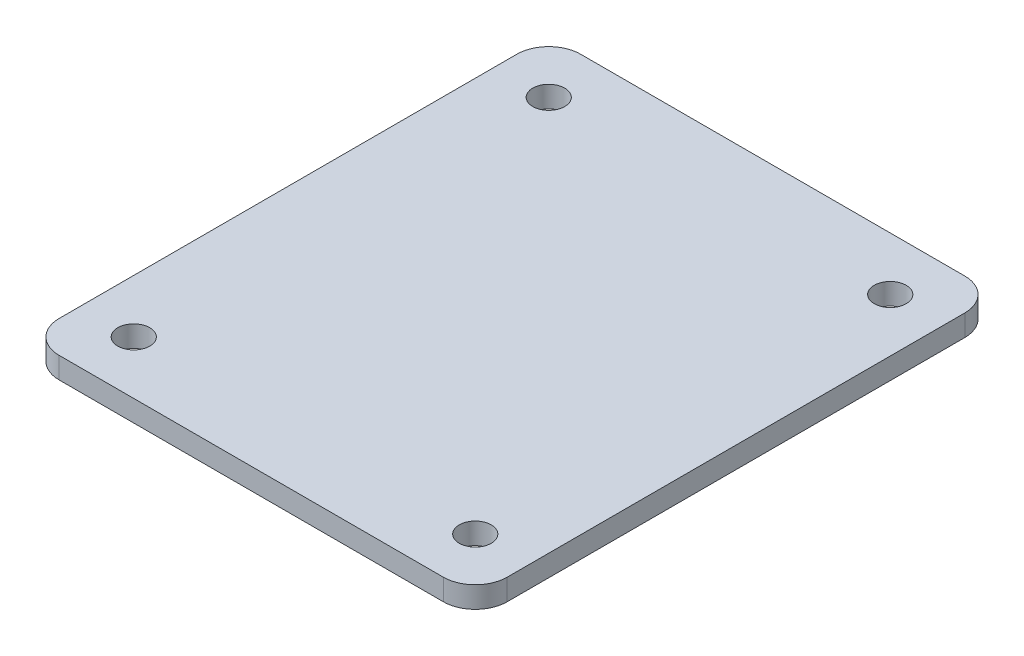
ISO-10303-21;
HEADER;
FILE_DESCRIPTION(('STEP AP214'),'2;1');
FILE_NAME('part.step','',(''),(''),'','','');
FILE_SCHEMA(('AUTOMOTIVE_DESIGN { 1 0 10303 214 1 1 1 1 }'));
ENDSEC;
DATA;
#1=APPLICATION_CONTEXT('core data for automotive mechanical design processes');
#2=APPLICATION_PROTOCOL_DEFINITION('international standard','automotive_design',2000,#1);
#3=PRODUCT_CONTEXT('',#1,'mechanical');
#4=PRODUCT('Part','Part','',(#3));
#5=PRODUCT_RELATED_PRODUCT_CATEGORY('part','',(#4));
#6=PRODUCT_DEFINITION_FORMATION('','',#4);
#7=PRODUCT_DEFINITION_CONTEXT('part definition',#1,'design');
#8=PRODUCT_DEFINITION('design','',#6,#7);
#9=PRODUCT_DEFINITION_SHAPE('','',#8);
#10=(LENGTH_UNIT() NAMED_UNIT(*) SI_UNIT(.MILLI.,.METRE.));
#11=(NAMED_UNIT(*) PLANE_ANGLE_UNIT() SI_UNIT($,.RADIAN.));
#12=(NAMED_UNIT(*) SI_UNIT($,.STERADIAN.) SOLID_ANGLE_UNIT());
#13=UNCERTAINTY_MEASURE_WITH_UNIT(LENGTH_MEASURE(1.E-05),#10,'distance_accuracy_value','');
#14=(GEOMETRIC_REPRESENTATION_CONTEXT(3) GLOBAL_UNCERTAINTY_ASSIGNED_CONTEXT((#13)) GLOBAL_UNIT_ASSIGNED_CONTEXT((#10,
#11,#12)) REPRESENTATION_CONTEXT('',''));
#15=CARTESIAN_POINT('',(0.,0.,0.));
#16=DIRECTION('',(0.,0.,1.));
#17=DIRECTION('',(1.,0.,0.));
#18=AXIS2_PLACEMENT_3D('',#15,#16,#17);
#19=CARTESIAN_POINT('',(21.0193971695219,2.,24.4666027061899));
#20=DIRECTION('',(-1.,0.,0.));
#21=DIRECTION('',(0.,0.,1.));
#22=AXIS2_PLACEMENT_3D('',#19,#20,#21);
#23=PLANE('',#22);
#24=DIRECTION('',(0.,0.,-1.));
#25=VECTOR('',#24,1.);
#26=CARTESIAN_POINT('',(21.0193971695219,0.,24.4666027061899));
#27=LINE('',#26,#25);
#28=CARTESIAN_POINT('',(21.0193971695219,0.,21.4666027061899));
#29=VERTEX_POINT('',#28);
#30=CARTESIAN_POINT('',(21.0193971695219,0.,-21.4666027061899));
#31=VERTEX_POINT('',#30);
#32=EDGE_CURVE('E132',#29,#31,#27,.T.);
#33=ORIENTED_EDGE('',*,*,#32,.T.);
#34=DIRECTION('',(0.,-1.,0.));
#35=VECTOR('',#34,1.);
#36=CARTESIAN_POINT('',(21.0193971695219,2.,-21.4666027061899));
#37=LINE('',#36,#35);
#38=CARTESIAN_POINT('',(21.0193971695219,2.,-21.4666027061899));
#39=VERTEX_POINT('',#38);
#40=EDGE_CURVE('E155',#31,#39,#37,.F.);
#41=ORIENTED_EDGE('',*,*,#40,.T.);
#42=DIRECTION('',(0.,0.,-1.));
#43=VECTOR('',#42,1.);
#44=CARTESIAN_POINT('',(21.0193971695219,2.,24.4666027061899));
#45=LINE('',#44,#43);
#46=CARTESIAN_POINT('',(21.0193971695219,2.,21.4666027061899));
#47=VERTEX_POINT('',#46);
#48=EDGE_CURVE('E130',#47,#39,#45,.T.);
#49=ORIENTED_EDGE('',*,*,#48,.F.);
#50=DIRECTION('',(0.,-1.,0.));
#51=VECTOR('',#50,1.);
#52=CARTESIAN_POINT('',(21.0193971695219,2.,21.4666027061899));
#53=LINE('',#52,#51);
#54=EDGE_CURVE('E152',#47,#29,#53,.T.);
#55=ORIENTED_EDGE('',*,*,#54,.T.);
#56=EDGE_LOOP('',(#33,#41,#49,#55));
#57=FACE_BOUND('',#56,.T.);
#58=ADVANCED_FACE('F37',(#57),#23,.F.);
#59=CARTESIAN_POINT('',(-21.0193971695219,2.,-24.4666027061899));
#60=DIRECTION('',(0.,0.,1.));
#61=DIRECTION('',(1.,0.,0.));
#62=AXIS2_PLACEMENT_3D('',#59,#60,#61);
#63=PLANE('',#62);
#64=DIRECTION('',(-1.,0.,0.));
#65=VECTOR('',#64,1.);
#66=CARTESIAN_POINT('',(-21.0193971695219,0.,-24.4666027061899));
#67=LINE('',#66,#65);
#68=CARTESIAN_POINT('',(18.0193971695219,0.,-24.4666027061899));
#69=VERTEX_POINT('',#68);
#70=CARTESIAN_POINT('',(-18.0193971695219,0.,-24.4666027061899));
#71=VERTEX_POINT('',#70);
#72=EDGE_CURVE('E128',#69,#71,#67,.T.);
#73=ORIENTED_EDGE('',*,*,#72,.T.);
#74=DIRECTION('',(0.,-1.,0.));
#75=VECTOR('',#74,1.);
#76=CARTESIAN_POINT('',(-18.0193971695219,2.,-24.4666027061899));
#77=LINE('',#76,#75);
#78=CARTESIAN_POINT('',(-18.0193971695219,2.,-24.4666027061899));
#79=VERTEX_POINT('',#78);
#80=EDGE_CURVE('E107',#71,#79,#77,.F.);
#81=ORIENTED_EDGE('',*,*,#80,.T.);
#82=DIRECTION('',(-1.,0.,0.));
#83=VECTOR('',#82,1.);
#84=CARTESIAN_POINT('',(-21.0193971695219,2.,-24.4666027061899));
#85=LINE('',#84,#83);
#86=CARTESIAN_POINT('',(18.0193971695219,2.,-24.4666027061899));
#87=VERTEX_POINT('',#86);
#88=EDGE_CURVE('E171',#87,#79,#85,.T.);
#89=ORIENTED_EDGE('',*,*,#88,.F.);
#90=DIRECTION('',(0.,-1.,0.));
#91=VECTOR('',#90,1.);
#92=CARTESIAN_POINT('',(18.0193971695219,2.,-24.4666027061899));
#93=LINE('',#92,#91);
#94=EDGE_CURVE('E112',#87,#69,#93,.T.);
#95=ORIENTED_EDGE('',*,*,#94,.T.);
#96=EDGE_LOOP('',(#73,#81,#89,#95));
#97=FACE_BOUND('',#96,.T.);
#98=ADVANCED_FACE('F223',(#97),#63,.F.);
#99=CARTESIAN_POINT('',(-21.0193971695219,2.,24.4666027061899));
#100=DIRECTION('',(1.,0.,0.));
#101=DIRECTION('',(0.,0.,-1.));
#102=AXIS2_PLACEMENT_3D('',#99,#100,#101);
#103=PLANE('',#102);
#104=DIRECTION('',(0.,0.,1.));
#105=VECTOR('',#104,1.);
#106=CARTESIAN_POINT('',(-21.0193971695219,2.,24.4666027061899));
#107=LINE('',#106,#105);
#108=CARTESIAN_POINT('',(-21.0193971695219,2.,-21.4666027061899));
#109=VERTEX_POINT('',#108);
#110=CARTESIAN_POINT('',(-21.0193971695219,2.,21.4666027061899));
#111=VERTEX_POINT('',#110);
#112=EDGE_CURVE('E121',#109,#111,#107,.T.);
#113=ORIENTED_EDGE('',*,*,#112,.F.);
#114=DIRECTION('',(0.,-1.,0.));
#115=VECTOR('',#114,1.);
#116=CARTESIAN_POINT('',(-21.0193971695219,2.,-21.4666027061899));
#117=LINE('',#116,#115);
#118=CARTESIAN_POINT('',(-21.0193971695219,0.,-21.4666027061899));
#119=VERTEX_POINT('',#118);
#120=EDGE_CURVE('E106',#109,#119,#117,.T.);
#121=ORIENTED_EDGE('',*,*,#120,.T.);
#122=DIRECTION('',(0.,0.,1.));
#123=VECTOR('',#122,1.);
#124=CARTESIAN_POINT('',(-21.0193971695219,0.,24.4666027061899));
#125=LINE('',#124,#123);
#126=CARTESIAN_POINT('',(-21.0193971695219,0.,21.4666027061899));
#127=VERTEX_POINT('',#126);
#128=EDGE_CURVE('E119',#119,#127,#125,.T.);
#129=ORIENTED_EDGE('',*,*,#128,.T.);
#130=DIRECTION('',(0.,-1.,0.));
#131=VECTOR('',#130,1.);
#132=CARTESIAN_POINT('',(-21.0193971695219,2.,21.4666027061899));
#133=LINE('',#132,#131);
#134=EDGE_CURVE('E123',#127,#111,#133,.F.);
#135=ORIENTED_EDGE('',*,*,#134,.T.);
#136=EDGE_LOOP('',(#113,#121,#129,#135));
#137=FACE_BOUND('',#136,.T.);
#138=ADVANCED_FACE('F118',(#137),#103,.F.);
#139=CARTESIAN_POINT('',(-21.0193971695219,2.,24.4666027061899));
#140=DIRECTION('',(0.,0.,-1.));
#141=DIRECTION('',(-1.,0.,0.));
#142=AXIS2_PLACEMENT_3D('',#139,#140,#141);
#143=PLANE('',#142);
#144=DIRECTION('',(1.,0.,0.));
#145=VECTOR('',#144,1.);
#146=CARTESIAN_POINT('',(-21.0193971695219,0.,24.4666027061899));
#147=LINE('',#146,#145);
#148=CARTESIAN_POINT('',(-18.0193971695219,0.,24.4666027061899));
#149=VERTEX_POINT('',#148);
#150=CARTESIAN_POINT('',(18.0193971695219,0.,24.4666027061899));
#151=VERTEX_POINT('',#150);
#152=EDGE_CURVE('E127',#149,#151,#147,.T.);
#153=ORIENTED_EDGE('',*,*,#152,.T.);
#154=DIRECTION('',(0.,-1.,0.));
#155=VECTOR('',#154,1.);
#156=CARTESIAN_POINT('',(18.0193971695219,2.,24.4666027061899));
#157=LINE('',#156,#155);
#158=CARTESIAN_POINT('',(18.0193971695219,2.,24.4666027061899));
#159=VERTEX_POINT('',#158);
#160=EDGE_CURVE('E11',#151,#159,#157,.F.);
#161=ORIENTED_EDGE('',*,*,#160,.T.);
#162=DIRECTION('',(1.,0.,0.));
#163=VECTOR('',#162,1.);
#164=CARTESIAN_POINT('',(-21.0193971695219,2.,24.4666027061899));
#165=LINE('',#164,#163);
#166=CARTESIAN_POINT('',(-18.0193971695219,2.,24.4666027061899));
#167=VERTEX_POINT('',#166);
#168=EDGE_CURVE('E136',#167,#159,#165,.T.);
#169=ORIENTED_EDGE('',*,*,#168,.F.);
#170=DIRECTION('',(0.,-1.,0.));
#171=VECTOR('',#170,1.);
#172=CARTESIAN_POINT('',(-18.0193971695219,2.,24.4666027061899));
#173=LINE('',#172,#171);
#174=EDGE_CURVE('E45',#167,#149,#173,.T.);
#175=ORIENTED_EDGE('',*,*,#174,.T.);
#176=EDGE_LOOP('',(#153,#161,#169,#175));
#177=FACE_BOUND('',#176,.T.);
#178=ADVANCED_FACE('F158',(#177),#143,.F.);
#179=CARTESIAN_POINT('',(0.,2.,0.));
#180=DIRECTION('',(0.,-1.,0.));
#181=DIRECTION('',(0.,0.,-1.));
#182=AXIS2_PLACEMENT_3D('',#179,#180,#181);
#183=PLANE('',#182);
#184=CARTESIAN_POINT('',(-16.0193971695219,2.,19.4666027061899));
#185=DIRECTION('',(0.,1.,0.));
#186=DIRECTION('',(0.,0.,1.));
#187=AXIS2_PLACEMENT_3D('',#184,#185,#186);
#188=CIRCLE('',#187,1.5);
#189=CARTESIAN_POINT('',(-16.0193971695219,2.,20.9666027061899));
#190=VERTEX_POINT('',#189);
#191=EDGE_CURVE('E187',#190,#190,#188,.T.);
#192=ORIENTED_EDGE('',*,*,#191,.F.);
#193=EDGE_LOOP('',(#192));
#194=FACE_BOUND('',#193,.T.);
#195=CARTESIAN_POINT('',(16.0193971695219,2.,19.4666027061899));
#196=DIRECTION('',(0.,1.,0.));
#197=DIRECTION('',(0.,0.,1.));
#198=AXIS2_PLACEMENT_3D('',#195,#196,#197);
#199=CIRCLE('',#198,1.5);
#200=CARTESIAN_POINT('',(16.0193971695219,2.,20.9666027061899));
#201=VERTEX_POINT('',#200);
#202=EDGE_CURVE('E193',#201,#201,#199,.T.);
#203=ORIENTED_EDGE('',*,*,#202,.F.);
#204=EDGE_LOOP('',(#203));
#205=FACE_BOUND('',#204,.T.);
#206=CARTESIAN_POINT('',(16.0193971695219,2.,-19.4666027061899));
#207=DIRECTION('',(0.,1.,0.));
#208=DIRECTION('',(0.,0.,1.));
#209=AXIS2_PLACEMENT_3D('',#206,#207,#208);
#210=CIRCLE('',#209,1.5);
#211=CARTESIAN_POINT('',(16.0193971695219,2.,-17.9666027061899));
#212=VERTEX_POINT('',#211);
#213=EDGE_CURVE('E199',#212,#212,#210,.T.);
#214=ORIENTED_EDGE('',*,*,#213,.F.);
#215=EDGE_LOOP('',(#214));
#216=FACE_BOUND('',#215,.T.);
#217=CARTESIAN_POINT('',(-16.0193971695219,2.,-19.4666027061899));
#218=DIRECTION('',(0.,1.,0.));
#219=DIRECTION('',(0.,0.,1.));
#220=AXIS2_PLACEMENT_3D('',#217,#218,#219);
#221=CIRCLE('',#220,1.5);
#222=CARTESIAN_POINT('',(-16.0193971695219,2.,-17.9666027061899));
#223=VERTEX_POINT('',#222);
#224=EDGE_CURVE('E176',#223,#223,#221,.T.);
#225=ORIENTED_EDGE('',*,*,#224,.F.);
#226=EDGE_LOOP('',(#225));
#227=FACE_BOUND('',#226,.T.);
#228=ORIENTED_EDGE('',*,*,#88,.T.);
#229=CARTESIAN_POINT('',(-18.0193971695219,2.,-21.4666027061899));
#230=DIRECTION('',(0.,-1.,0.));
#231=DIRECTION('',(0.,0.,-1.));
#232=AXIS2_PLACEMENT_3D('',#229,#230,#231);
#233=CIRCLE('',#232,3.);
#234=EDGE_CURVE('E150',#79,#109,#233,.F.);
#235=ORIENTED_EDGE('',*,*,#234,.T.);
#236=ORIENTED_EDGE('',*,*,#112,.T.);
#237=CARTESIAN_POINT('',(-18.0193971695219,2.,21.4666027061899));
#238=DIRECTION('',(0.,-1.,0.));
#239=DIRECTION('',(0.,0.,-1.));
#240=AXIS2_PLACEMENT_3D('',#237,#238,#239);
#241=CIRCLE('',#240,3.);
#242=EDGE_CURVE('E57',#111,#167,#241,.F.);
#243=ORIENTED_EDGE('',*,*,#242,.T.);
#244=ORIENTED_EDGE('',*,*,#168,.T.);
#245=CARTESIAN_POINT('',(18.0193971695219,2.,21.4666027061899));
#246=DIRECTION('',(0.,-1.,0.));
#247=DIRECTION('',(0.,0.,-1.));
#248=AXIS2_PLACEMENT_3D('',#245,#246,#247);
#249=CIRCLE('',#248,3.);
#250=EDGE_CURVE('E146',#159,#47,#249,.F.);
#251=ORIENTED_EDGE('',*,*,#250,.T.);
#252=ORIENTED_EDGE('',*,*,#48,.T.);
#253=CARTESIAN_POINT('',(18.0193971695219,2.,-21.4666027061899));
#254=DIRECTION('',(0.,-1.,0.));
#255=DIRECTION('',(0.,0.,-1.));
#256=AXIS2_PLACEMENT_3D('',#253,#254,#255);
#257=CIRCLE('',#256,3.);
#258=EDGE_CURVE('E148',#39,#87,#257,.F.);
#259=ORIENTED_EDGE('',*,*,#258,.T.);
#260=EDGE_LOOP('',(#228,#235,#236,#243,#244,#251,#252,#259));
#261=FACE_BOUND('',#260,.T.);
#262=ADVANCED_FACE('F214',(#194,#205,#216,#227,#261),#183,.F.);
#263=CARTESIAN_POINT('',(0.,0.,0.));
#264=DIRECTION('',(0.,-1.,0.));
#265=DIRECTION('',(0.,0.,-1.));
#266=AXIS2_PLACEMENT_3D('',#263,#264,#265);
#267=PLANE('',#266);
#268=CARTESIAN_POINT('',(-16.0193971695219,0.,19.4666027061899));
#269=DIRECTION('',(0.,1.,0.));
#270=DIRECTION('',(0.,0.,1.));
#271=AXIS2_PLACEMENT_3D('',#268,#269,#270);
#272=CIRCLE('',#271,1.5);
#273=CARTESIAN_POINT('',(-16.0193971695219,0.,20.9666027061899));
#274=VERTEX_POINT('',#273);
#275=EDGE_CURVE('E190',#274,#274,#272,.T.);
#276=ORIENTED_EDGE('',*,*,#275,.T.);
#277=EDGE_LOOP('',(#276));
#278=FACE_BOUND('',#277,.T.);
#279=CARTESIAN_POINT('',(16.0193971695219,0.,19.4666027061899));
#280=DIRECTION('',(0.,1.,0.));
#281=DIRECTION('',(0.,0.,1.));
#282=AXIS2_PLACEMENT_3D('',#279,#280,#281);
#283=CIRCLE('',#282,1.5);
#284=CARTESIAN_POINT('',(16.0193971695219,0.,20.9666027061899));
#285=VERTEX_POINT('',#284);
#286=EDGE_CURVE('E196',#285,#285,#283,.T.);
#287=ORIENTED_EDGE('',*,*,#286,.T.);
#288=EDGE_LOOP('',(#287));
#289=FACE_BOUND('',#288,.T.);
#290=CARTESIAN_POINT('',(16.0193971695219,0.,-19.4666027061899));
#291=DIRECTION('',(0.,1.,0.));
#292=DIRECTION('',(0.,0.,1.));
#293=AXIS2_PLACEMENT_3D('',#290,#291,#292);
#294=CIRCLE('',#293,1.5);
#295=CARTESIAN_POINT('',(16.0193971695219,0.,-17.9666027061899));
#296=VERTEX_POINT('',#295);
#297=EDGE_CURVE('E185',#296,#296,#294,.T.);
#298=ORIENTED_EDGE('',*,*,#297,.T.);
#299=EDGE_LOOP('',(#298));
#300=FACE_BOUND('',#299,.T.);
#301=CARTESIAN_POINT('',(-16.0193971695219,0.,-19.4666027061899));
#302=DIRECTION('',(0.,1.,0.));
#303=DIRECTION('',(0.,0.,1.));
#304=AXIS2_PLACEMENT_3D('',#301,#302,#303);
#305=CIRCLE('',#304,1.5);
#306=CARTESIAN_POINT('',(-16.0193971695219,0.,-17.9666027061899));
#307=VERTEX_POINT('',#306);
#308=EDGE_CURVE('E180',#307,#307,#305,.T.);
#309=ORIENTED_EDGE('',*,*,#308,.T.);
#310=EDGE_LOOP('',(#309));
#311=FACE_BOUND('',#310,.T.);
#312=ORIENTED_EDGE('',*,*,#128,.F.);
#313=CARTESIAN_POINT('',(-18.0193971695219,0.,-21.4666027061899));
#314=DIRECTION('',(0.,-1.,0.));
#315=DIRECTION('',(0.,0.,-1.));
#316=AXIS2_PLACEMENT_3D('',#313,#314,#315);
#317=CIRCLE('',#316,3.);
#318=EDGE_CURVE('E102',#119,#71,#317,.T.);
#319=ORIENTED_EDGE('',*,*,#318,.T.);
#320=ORIENTED_EDGE('',*,*,#72,.F.);
#321=CARTESIAN_POINT('',(18.0193971695219,0.,-21.4666027061899));
#322=DIRECTION('',(0.,-1.,0.));
#323=DIRECTION('',(0.,0.,-1.));
#324=AXIS2_PLACEMENT_3D('',#321,#322,#323);
#325=CIRCLE('',#324,3.);
#326=EDGE_CURVE('E113',#69,#31,#325,.T.);
#327=ORIENTED_EDGE('',*,*,#326,.T.);
#328=ORIENTED_EDGE('',*,*,#32,.F.);
#329=CARTESIAN_POINT('',(18.0193971695219,0.,21.4666027061899));
#330=DIRECTION('',(0.,-1.,0.));
#331=DIRECTION('',(0.,0.,-1.));
#332=AXIS2_PLACEMENT_3D('',#329,#330,#331);
#333=CIRCLE('',#332,3.);
#334=EDGE_CURVE('E139',#29,#151,#333,.T.);
#335=ORIENTED_EDGE('',*,*,#334,.T.);
#336=ORIENTED_EDGE('',*,*,#152,.F.);
#337=CARTESIAN_POINT('',(-18.0193971695219,0.,21.4666027061899));
#338=DIRECTION('',(0.,-1.,0.));
#339=DIRECTION('',(0.,0.,-1.));
#340=AXIS2_PLACEMENT_3D('',#337,#338,#339);
#341=CIRCLE('',#340,3.);
#342=EDGE_CURVE('E122',#149,#127,#341,.T.);
#343=ORIENTED_EDGE('',*,*,#342,.T.);
#344=EDGE_LOOP('',(#312,#319,#320,#327,#328,#335,#336,#343));
#345=FACE_BOUND('',#344,.T.);
#346=ADVANCED_FACE('F125',(#278,#289,#300,#311,#345),#267,.T.);
#347=CARTESIAN_POINT('',(-16.0193971695219,0.,-19.4666027061899));
#348=DIRECTION('',(0.,1.,0.));
#349=DIRECTION('',(0.,0.,1.));
#350=AXIS2_PLACEMENT_3D('',#347,#348,#349);
#351=CYLINDRICAL_SURFACE('',#350,1.5);
#352=ORIENTED_EDGE('',*,*,#308,.F.);
#353=EDGE_LOOP('',(#352));
#354=FACE_BOUND('',#353,.T.);
#355=ORIENTED_EDGE('',*,*,#224,.T.);
#356=EDGE_LOOP('',(#355));
#357=FACE_BOUND('',#356,.T.);
#358=ADVANCED_FACE('F210',(#354,#357),#351,.F.);
#359=CARTESIAN_POINT('',(16.0193971695219,0.,-19.4666027061899));
#360=DIRECTION('',(0.,1.,0.));
#361=DIRECTION('',(0.,0.,1.));
#362=AXIS2_PLACEMENT_3D('',#359,#360,#361);
#363=CYLINDRICAL_SURFACE('',#362,1.5);
#364=ORIENTED_EDGE('',*,*,#297,.F.);
#365=EDGE_LOOP('',(#364));
#366=FACE_BOUND('',#365,.T.);
#367=ORIENTED_EDGE('',*,*,#213,.T.);
#368=EDGE_LOOP('',(#367));
#369=FACE_BOUND('',#368,.T.);
#370=ADVANCED_FACE('F206',(#366,#369),#363,.F.);
#371=CARTESIAN_POINT('',(16.0193971695219,0.,19.4666027061899));
#372=DIRECTION('',(0.,1.,0.));
#373=DIRECTION('',(0.,0.,1.));
#374=AXIS2_PLACEMENT_3D('',#371,#372,#373);
#375=CYLINDRICAL_SURFACE('',#374,1.5);
#376=ORIENTED_EDGE('',*,*,#286,.F.);
#377=EDGE_LOOP('',(#376));
#378=FACE_BOUND('',#377,.T.);
#379=ORIENTED_EDGE('',*,*,#202,.T.);
#380=EDGE_LOOP('',(#379));
#381=FACE_BOUND('',#380,.T.);
#382=ADVANCED_FACE('F209',(#378,#381),#375,.F.);
#383=CARTESIAN_POINT('',(-16.0193971695219,0.,19.4666027061899));
#384=DIRECTION('',(0.,1.,0.));
#385=DIRECTION('',(0.,0.,1.));
#386=AXIS2_PLACEMENT_3D('',#383,#384,#385);
#387=CYLINDRICAL_SURFACE('',#386,1.5);
#388=ORIENTED_EDGE('',*,*,#275,.F.);
#389=EDGE_LOOP('',(#388));
#390=FACE_BOUND('',#389,.T.);
#391=ORIENTED_EDGE('',*,*,#191,.T.);
#392=EDGE_LOOP('',(#391));
#393=FACE_BOUND('',#392,.T.);
#394=ADVANCED_FACE('F232',(#390,#393),#387,.F.);
#395=CARTESIAN_POINT('',(-18.0193971695219,2.,-21.4666027061899));
#396=DIRECTION('',(0.,-1.,0.));
#397=DIRECTION('',(0.,0.,-1.));
#398=AXIS2_PLACEMENT_3D('',#395,#396,#397);
#399=CYLINDRICAL_SURFACE('',#398,3.);
#400=ORIENTED_EDGE('',*,*,#234,.F.);
#401=ORIENTED_EDGE('',*,*,#80,.F.);
#402=ORIENTED_EDGE('',*,*,#318,.F.);
#403=ORIENTED_EDGE('',*,*,#120,.F.);
#404=EDGE_LOOP('',(#400,#401,#402,#403));
#405=FACE_BOUND('',#404,.T.);
#406=ADVANCED_FACE('F105',(#405),#399,.T.);
#407=CARTESIAN_POINT('',(18.0193971695219,2.,-21.4666027061899));
#408=DIRECTION('',(0.,-1.,0.));
#409=DIRECTION('',(0.,0.,-1.));
#410=AXIS2_PLACEMENT_3D('',#407,#408,#409);
#411=CYLINDRICAL_SURFACE('',#410,3.);
#412=ORIENTED_EDGE('',*,*,#258,.F.);
#413=ORIENTED_EDGE('',*,*,#40,.F.);
#414=ORIENTED_EDGE('',*,*,#326,.F.);
#415=ORIENTED_EDGE('',*,*,#94,.F.);
#416=EDGE_LOOP('',(#412,#413,#414,#415));
#417=FACE_BOUND('',#416,.T.);
#418=ADVANCED_FACE('F225',(#417),#411,.T.);
#419=CARTESIAN_POINT('',(18.0193971695219,2.,21.4666027061899));
#420=DIRECTION('',(0.,-1.,0.));
#421=DIRECTION('',(0.,0.,-1.));
#422=AXIS2_PLACEMENT_3D('',#419,#420,#421);
#423=CYLINDRICAL_SURFACE('',#422,3.);
#424=ORIENTED_EDGE('',*,*,#250,.F.);
#425=ORIENTED_EDGE('',*,*,#160,.F.);
#426=ORIENTED_EDGE('',*,*,#334,.F.);
#427=ORIENTED_EDGE('',*,*,#54,.F.);
#428=EDGE_LOOP('',(#424,#425,#426,#427));
#429=FACE_BOUND('',#428,.T.);
#430=ADVANCED_FACE('F165',(#429),#423,.T.);
#431=CARTESIAN_POINT('',(-18.0193971695219,2.,21.4666027061899));
#432=DIRECTION('',(0.,-1.,0.));
#433=DIRECTION('',(0.,0.,-1.));
#434=AXIS2_PLACEMENT_3D('',#431,#432,#433);
#435=CYLINDRICAL_SURFACE('',#434,3.);
#436=ORIENTED_EDGE('',*,*,#242,.F.);
#437=ORIENTED_EDGE('',*,*,#134,.F.);
#438=ORIENTED_EDGE('',*,*,#342,.F.);
#439=ORIENTED_EDGE('',*,*,#174,.F.);
#440=EDGE_LOOP('',(#436,#437,#438,#439));
#441=FACE_BOUND('',#440,.T.);
#442=ADVANCED_FACE('F39',(#441),#435,.T.);
#443=CLOSED_SHELL('',(#58,#98,#138,#178,#262,#346,#358,#370,#382,#394,#406,#418,#430,#442));
#444=MANIFOLD_SOLID_BREP('B2',#443);
#445=ADVANCED_BREP_SHAPE_REPRESENTATION('',(#18,#444),#14);
#446=SHAPE_DEFINITION_REPRESENTATION(#9,#445);
ENDSEC;
END-ISO-10303-21;
